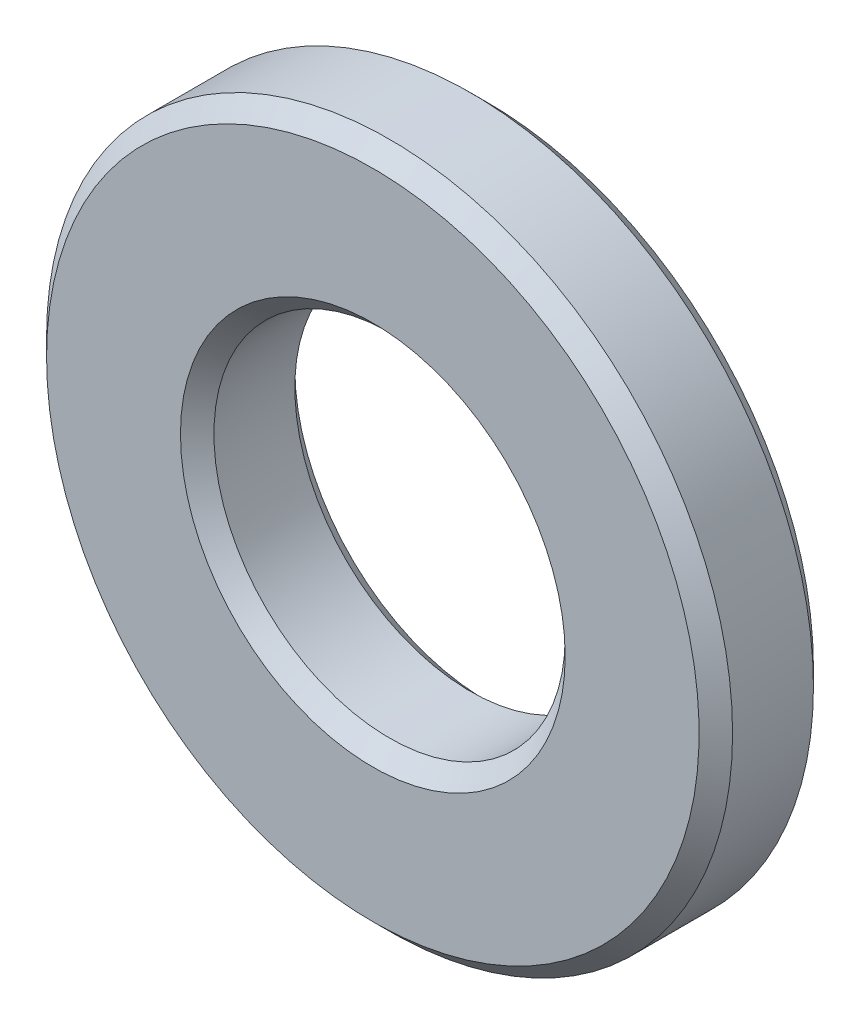
ISO-10303-21;
HEADER;
FILE_DESCRIPTION(('STEP AP214'),'2;1');
FILE_NAME('part.step','',(''),(''),'','','');
FILE_SCHEMA(('AUTOMOTIVE_DESIGN { 1 0 10303 214 1 1 1 1 }'));
ENDSEC;
DATA;
#1=APPLICATION_CONTEXT('core data for automotive mechanical design processes');
#2=APPLICATION_PROTOCOL_DEFINITION('international standard','automotive_design',2000,#1);
#3=PRODUCT_CONTEXT('',#1,'mechanical');
#4=PRODUCT('Part','Part','',(#3));
#5=PRODUCT_RELATED_PRODUCT_CATEGORY('part','',(#4));
#6=PRODUCT_DEFINITION_FORMATION('','',#4);
#7=PRODUCT_DEFINITION_CONTEXT('part definition',#1,'design');
#8=PRODUCT_DEFINITION('design','',#6,#7);
#9=PRODUCT_DEFINITION_SHAPE('','',#8);
#10=(LENGTH_UNIT() NAMED_UNIT(*) SI_UNIT(.MILLI.,.METRE.));
#11=(NAMED_UNIT(*) PLANE_ANGLE_UNIT() SI_UNIT($,.RADIAN.));
#12=(NAMED_UNIT(*) SI_UNIT($,.STERADIAN.) SOLID_ANGLE_UNIT());
#13=UNCERTAINTY_MEASURE_WITH_UNIT(LENGTH_MEASURE(1.E-05),#10,'distance_accuracy_value','');
#14=(GEOMETRIC_REPRESENTATION_CONTEXT(3) GLOBAL_UNCERTAINTY_ASSIGNED_CONTEXT((#13)) GLOBAL_UNIT_ASSIGNED_CONTEXT((#10,
#11,#12)) REPRESENTATION_CONTEXT('',''));
#15=CARTESIAN_POINT('',(0.,0.,0.));
#16=DIRECTION('',(0.,0.,1.));
#17=DIRECTION('',(1.,0.,0.));
#18=AXIS2_PLACEMENT_3D('',#15,#16,#17);
#19=CARTESIAN_POINT('',(0.,0.,-0.79375));
#20=DIRECTION('',(0.,0.,1.));
#21=DIRECTION('',(1.,0.,0.));
#22=AXIS2_PLACEMENT_3D('',#19,#20,#21);
#23=CYLINDRICAL_SURFACE('',#22,4.7625);
#24=CARTESIAN_POINT('',(0.,0.,0.561340000000001));
#25=DIRECTION('',(0.,0.,1.));
#26=DIRECTION('',(1.,0.,0.));
#27=AXIS2_PLACEMENT_3D('',#24,#25,#26);
#28=CIRCLE('',#27,4.7625);
#29=CARTESIAN_POINT('',(-4.7625,0.,0.561340000000001));
#30=VERTEX_POINT('',#29);
#31=EDGE_CURVE('E55',#30,#30,#28,.F.);
#32=ORIENTED_EDGE('',*,*,#31,.T.);
#33=EDGE_LOOP('',(#32));
#34=FACE_BOUND('',#33,.T.);
#35=CARTESIAN_POINT('',(0.,0.,-0.561340000000002));
#36=DIRECTION('',(0.,0.,1.));
#37=DIRECTION('',(1.,0.,0.));
#38=AXIS2_PLACEMENT_3D('',#35,#36,#37);
#39=CIRCLE('',#38,4.7625);
#40=CARTESIAN_POINT('',(4.7625,0.,-0.561340000000002));
#41=VERTEX_POINT('',#40);
#42=EDGE_CURVE('E58',#41,#41,#39,.T.);
#43=ORIENTED_EDGE('',*,*,#42,.T.);
#44=EDGE_LOOP('',(#43));
#45=FACE_BOUND('',#44,.T.);
#46=ADVANCED_FACE('F35',(#34,#45),#23,.T.);
#47=CARTESIAN_POINT('',(0.,0.,-0.79375));
#48=DIRECTION('',(0.,0.,1.));
#49=DIRECTION('',(1.,0.,0.));
#50=AXIS2_PLACEMENT_3D('',#47,#48,#49);
#51=PLANE('',#50);
#52=CARTESIAN_POINT('',(0.,0.,-0.79375));
#53=DIRECTION('',(0.,0.,1.));
#54=DIRECTION('',(1.,0.,0.));
#55=AXIS2_PLACEMENT_3D('',#52,#53,#54);
#56=CIRCLE('',#55,4.53009);
#57=CARTESIAN_POINT('',(4.53009,0.,-0.79375));
#58=VERTEX_POINT('',#57);
#59=EDGE_CURVE('E46',#58,#58,#56,.F.);
#60=ORIENTED_EDGE('',*,*,#59,.T.);
#61=EDGE_LOOP('',(#60));
#62=FACE_BOUND('',#61,.T.);
#63=CARTESIAN_POINT('',(0.,0.,-0.79375));
#64=DIRECTION('',(0.,0.,1.));
#65=DIRECTION('',(1.,0.,0.));
#66=AXIS2_PLACEMENT_3D('',#63,#64,#65);
#67=CIRCLE('',#66,2.67081);
#68=CARTESIAN_POINT('',(2.67081,0.,-0.79375));
#69=VERTEX_POINT('',#68);
#70=EDGE_CURVE('E50',#69,#69,#67,.T.);
#71=ORIENTED_EDGE('',*,*,#70,.T.);
#72=EDGE_LOOP('',(#71));
#73=FACE_BOUND('',#72,.T.);
#74=ADVANCED_FACE('F83',(#62,#73),#51,.F.);
#75=CARTESIAN_POINT('',(0.,0.,-0.79375));
#76=DIRECTION('',(0.,0.,1.));
#77=DIRECTION('',(1.,0.,0.));
#78=AXIS2_PLACEMENT_3D('',#75,#76,#77);
#79=CYLINDRICAL_SURFACE('',#78,2.4384);
#80=CARTESIAN_POINT('',(0.,0.,0.56134));
#81=DIRECTION('',(0.,0.,1.));
#82=DIRECTION('',(1.,0.,0.));
#83=AXIS2_PLACEMENT_3D('',#80,#81,#82);
#84=CIRCLE('',#83,2.4384);
#85=CARTESIAN_POINT('',(2.4384,0.,0.56134));
#86=VERTEX_POINT('',#85);
#87=EDGE_CURVE('E10',#86,#86,#84,.T.);
#88=ORIENTED_EDGE('',*,*,#87,.T.);
#89=EDGE_LOOP('',(#88));
#90=FACE_BOUND('',#89,.T.);
#91=CARTESIAN_POINT('',(0.,0.,-0.56134));
#92=DIRECTION('',(0.,0.,1.));
#93=DIRECTION('',(1.,0.,0.));
#94=AXIS2_PLACEMENT_3D('',#91,#92,#93);
#95=CIRCLE('',#94,2.4384);
#96=CARTESIAN_POINT('',(2.4384,0.,-0.56134));
#97=VERTEX_POINT('',#96);
#98=EDGE_CURVE('E42',#97,#97,#95,.F.);
#99=ORIENTED_EDGE('',*,*,#98,.T.);
#100=EDGE_LOOP('',(#99));
#101=FACE_BOUND('',#100,.T.);
#102=ADVANCED_FACE('F89',(#90,#101),#79,.F.);
#103=CARTESIAN_POINT('',(0.,0.,0.79375));
#104=DIRECTION('',(0.,0.,1.));
#105=DIRECTION('',(1.,0.,0.));
#106=AXIS2_PLACEMENT_3D('',#103,#104,#105);
#107=PLANE('',#106);
#108=CARTESIAN_POINT('',(0.,0.,0.79375));
#109=DIRECTION('',(0.,0.,1.));
#110=DIRECTION('',(1.,0.,0.));
#111=AXIS2_PLACEMENT_3D('',#108,#109,#110);
#112=CIRCLE('',#111,4.53009);
#113=CARTESIAN_POINT('',(-4.53009,0.,0.79375));
#114=VERTEX_POINT('',#113);
#115=EDGE_CURVE('E61',#114,#114,#112,.T.);
#116=ORIENTED_EDGE('',*,*,#115,.T.);
#117=EDGE_LOOP('',(#116));
#118=FACE_BOUND('',#117,.T.);
#119=CARTESIAN_POINT('',(0.,0.,0.79375));
#120=DIRECTION('',(0.,0.,1.));
#121=DIRECTION('',(1.,0.,0.));
#122=AXIS2_PLACEMENT_3D('',#119,#120,#121);
#123=CIRCLE('',#122,2.67081);
#124=CARTESIAN_POINT('',(2.67081,0.,0.79375));
#125=VERTEX_POINT('',#124);
#126=EDGE_CURVE('E64',#125,#125,#123,.F.);
#127=ORIENTED_EDGE('',*,*,#126,.T.);
#128=EDGE_LOOP('',(#127));
#129=FACE_BOUND('',#128,.T.);
#130=ADVANCED_FACE('F68',(#118,#129),#107,.T.);
#131=CARTESIAN_POINT('',(0.,0.,0.79375));
#132=DIRECTION('',(0.,0.,-1.));
#133=DIRECTION('',(-1.,0.,0.));
#134=AXIS2_PLACEMENT_3D('',#131,#132,#133);
#135=CONICAL_SURFACE('',#134,4.53009,0.785398163397447);
#136=CARTESIAN_POINT('',(-4.7625,0.,0.561340000000001));
#137=CARTESIAN_POINT('',(-4.7600790625,0.,0.563760937500001));
#138=CARTESIAN_POINT('',(-4.757658125,0.,0.566181875000001));
#139=CARTESIAN_POINT('',(-4.75281625,0.,0.571023750000001));
#140=CARTESIAN_POINT('',(-4.7503953125,0.,0.573444687500001));
#141=CARTESIAN_POINT('',(-4.7455534375,0.,0.578286562500001));
#142=CARTESIAN_POINT('',(-4.7431325,0.,0.580707500000001));
#143=CARTESIAN_POINT('',(-4.738290625,0.,0.585549375000001));
#144=CARTESIAN_POINT('',(-4.7358696875,0.,0.587970312500001));
#145=CARTESIAN_POINT('',(-4.7310278125,0.,0.592812187500001));
#146=CARTESIAN_POINT('',(-4.728606875,0.,0.595233125000001));
#147=CARTESIAN_POINT('',(-4.723765,0.,0.600075000000001));
#148=CARTESIAN_POINT('',(-4.7213440625,0.,0.602495937500001));
#149=CARTESIAN_POINT('',(-4.7165021875,0.,0.607337812500001));
#150=CARTESIAN_POINT('',(-4.71408125,0.,0.609758750000001));
#151=CARTESIAN_POINT('',(-4.709239375,0.,0.614600625000001));
#152=CARTESIAN_POINT('',(-4.7068184375,0.,0.617021562500001));
#153=CARTESIAN_POINT('',(-4.7019765625,0.,0.621863437500001));
#154=CARTESIAN_POINT('',(-4.699555625,0.,0.624284375000001));
#155=CARTESIAN_POINT('',(-4.69471375,0.,0.629126250000001));
#156=CARTESIAN_POINT('',(-4.6922928125,0.,0.631547187500001));
#157=CARTESIAN_POINT('',(-4.6874509375,0.,0.636389062500001));
#158=CARTESIAN_POINT('',(-4.68503,0.,0.638810000000001));
#159=CARTESIAN_POINT('',(-4.680188125,0.,0.643651875000001));
#160=CARTESIAN_POINT('',(-4.6777671875,0.,0.646072812500001));
#161=CARTESIAN_POINT('',(-4.6729253125,0.,0.650914687500001));
#162=CARTESIAN_POINT('',(-4.670504375,0.,0.653335625000001));
#163=CARTESIAN_POINT('',(-4.6656625,0.,0.658177500000001));
#164=CARTESIAN_POINT('',(-4.6632415625,0.,0.660598437500001));
#165=CARTESIAN_POINT('',(-4.6583996875,0.,0.665440312500001));
#166=CARTESIAN_POINT('',(-4.65597875,0.,0.667861250000001));
#167=CARTESIAN_POINT('',(-4.651136875,0.,0.672703125000001));
#168=CARTESIAN_POINT('',(-4.6487159375,0.,0.675124062500001));
#169=CARTESIAN_POINT('',(-4.6438740625,0.,0.679965937500001));
#170=CARTESIAN_POINT('',(-4.641453125,0.,0.682386875000001));
#171=CARTESIAN_POINT('',(-4.63661125,0.,0.68722875));
#172=CARTESIAN_POINT('',(-4.6341903125,0.,0.689649687500001));
#173=CARTESIAN_POINT('',(-4.6293484375,0.,0.694491562500001));
#174=CARTESIAN_POINT('',(-4.6269275,0.,0.696912500000001));
#175=CARTESIAN_POINT('',(-4.622085625,0.,0.701754375));
#176=CARTESIAN_POINT('',(-4.6196646875,0.,0.704175312500001));
#177=CARTESIAN_POINT('',(-4.6148228125,0.,0.7090171875));
#178=CARTESIAN_POINT('',(-4.612401875,0.,0.711438125));
#179=CARTESIAN_POINT('',(-4.60756,0.,0.71628));
#180=CARTESIAN_POINT('',(-4.6051390625,0.,0.718700937500001));
#181=CARTESIAN_POINT('',(-4.6002971875,0.,0.7235428125));
#182=CARTESIAN_POINT('',(-4.59787625,0.,0.72596375));
#183=CARTESIAN_POINT('',(-4.593034375,0.,0.730805625));
#184=CARTESIAN_POINT('',(-4.5906134375,0.,0.733226562500001));
#185=CARTESIAN_POINT('',(-4.5857715625,0.,0.738068437500001));
#186=CARTESIAN_POINT('',(-4.583350625,0.,0.740489375));
#187=CARTESIAN_POINT('',(-4.57850875,0.,0.74533125));
#188=CARTESIAN_POINT('',(-4.5760878125,0.,0.7477521875));
#189=CARTESIAN_POINT('',(-4.5712459375,0.,0.7525940625));
#190=CARTESIAN_POINT('',(-4.568825,0.,0.755015));
#191=CARTESIAN_POINT('',(-4.563983125,0.,0.759856875));
#192=CARTESIAN_POINT('',(-4.5615621875,0.,0.7622778125));
#193=CARTESIAN_POINT('',(-4.5567203125,0.,0.7671196875));
#194=CARTESIAN_POINT('',(-4.554299375,0.,0.769540625));
#195=CARTESIAN_POINT('',(-4.5494575,0.,0.7743825));
#196=CARTESIAN_POINT('',(-4.5470365625,0.,0.7768034375));
#197=CARTESIAN_POINT('',(-4.5421946875,0.,0.7816453125));
#198=CARTESIAN_POINT('',(-4.53977375,0.,0.78406625));
#199=CARTESIAN_POINT('',(-4.534931875,0.,0.788908125));
#200=CARTESIAN_POINT('',(-4.5325109375,0.,0.7913290625));
#201=CARTESIAN_POINT('',(-4.53009,0.,0.79375));
#202=B_SPLINE_CURVE_WITH_KNOTS('',3,(#136,#137,#138,#139,#140,#141,#142,#143,#144,#145,#146,
#147,#148,#149,#150,#151,#152,#153,#154,#155,#156,#157,#158,#159,#160,#161,#162,#163,#164,#165,
#166,#167,#168,#169,#170,#171,#172,#173,#174,#175,#176,#177,#178,#179,#180,#181,#182,#183,#184,
#185,#186,#187,#188,#189,#190,#191,#192,#193,#194,#195,#196,#197,#198,#199,#200,#201),
.UNSPECIFIED.,.F.,.F.,(4,2,2,2,2,2,2,2,2,2,2,2,2,2,2,2,2,2,2,2,2,2,2,2,2,2,2,2,2,2,2,2,4),(0.,
0.0102711679384726,0.0205423358769457,0.0308135038154183,0.0410846717538909,0.051355839692364,
0.0616270076308366,0.0718981755693092,0.0821693435077823,0.0924405114462549,0.102711679384727,
0.112982847323201,0.123254015261673,0.133525183200146,0.143796351138619,0.154067519077092,
0.164338687015564,0.174609854954037,0.18488102289251,0.195152190830982,0.205423358769456,
0.215694526707928,0.225965694646401,0.236236862584874,0.246508030523347,0.25677919846182,
0.267050366400292,0.277321534338765,0.287592702277238,0.297863870215711,0.308135038154183,
0.318406206092656,0.328677374031129),.UNSPECIFIED.);
#203=EDGE_CURVE('BSEAM79',#30,#114,#202,.T.);
#204=ORIENTED_EDGE('',*,*,#31,.F.);
#205=ORIENTED_EDGE('',*,*,#115,.F.);
#206=ORIENTED_EDGE('',*,*,#203,.T.);
#207=ORIENTED_EDGE('',*,*,#203,.F.);
#208=EDGE_LOOP('',(#204,#206,#205,#207));
#209=FACE_BOUND('',#208,.T.);
#210=ADVANCED_FACE('F79',(#209),#135,.T.);
#211=CARTESIAN_POINT('',(0.,0.,-0.561340000000002));
#212=DIRECTION('',(0.,0.,1.));
#213=DIRECTION('',(1.,0.,0.));
#214=AXIS2_PLACEMENT_3D('',#211,#212,#213);
#215=CONICAL_SURFACE('',#214,4.7625,0.78539816339745);
#216=ORIENTED_EDGE('',*,*,#59,.F.);
#217=EDGE_LOOP('',(#216));
#218=FACE_BOUND('',#217,.T.);
#219=ORIENTED_EDGE('',*,*,#42,.F.);
#220=EDGE_LOOP('',(#219));
#221=FACE_BOUND('',#220,.T.);
#222=ADVANCED_FACE('F73',(#218,#221),#215,.T.);
#223=CARTESIAN_POINT('',(0.,0.,0.56134));
#224=DIRECTION('',(0.,0.,1.));
#225=DIRECTION('',(1.,0.,0.));
#226=AXIS2_PLACEMENT_3D('',#223,#224,#225);
#227=CONICAL_SURFACE('',#226,2.4384,0.78539816339745);
#228=ORIENTED_EDGE('',*,*,#126,.F.);
#229=EDGE_LOOP('',(#228));
#230=FACE_BOUND('',#229,.T.);
#231=ORIENTED_EDGE('',*,*,#87,.F.);
#232=EDGE_LOOP('',(#231));
#233=FACE_BOUND('',#232,.T.);
#234=ADVANCED_FACE('F70',(#230,#233),#227,.F.);
#235=CARTESIAN_POINT('',(0.,0.,-0.79375));
#236=DIRECTION('',(0.,0.,-1.));
#237=DIRECTION('',(-1.,0.,0.));
#238=AXIS2_PLACEMENT_3D('',#235,#236,#237);
#239=CONICAL_SURFACE('',#238,2.67081,0.785398163397447);
#240=ORIENTED_EDGE('',*,*,#98,.F.);
#241=EDGE_LOOP('',(#240));
#242=FACE_BOUND('',#241,.T.);
#243=ORIENTED_EDGE('',*,*,#70,.F.);
#244=EDGE_LOOP('',(#243));
#245=FACE_BOUND('',#244,.T.);
#246=ADVANCED_FACE('F37',(#242,#245),#239,.F.);
#247=CLOSED_SHELL('',(#46,#74,#102,#130,#210,#222,#234,#246));
#248=MANIFOLD_SOLID_BREP('B2',#247);
#249=ADVANCED_BREP_SHAPE_REPRESENTATION('',(#18,#248),#14);
#250=SHAPE_DEFINITION_REPRESENTATION(#9,#249);
ENDSEC;
END-ISO-10303-21;
